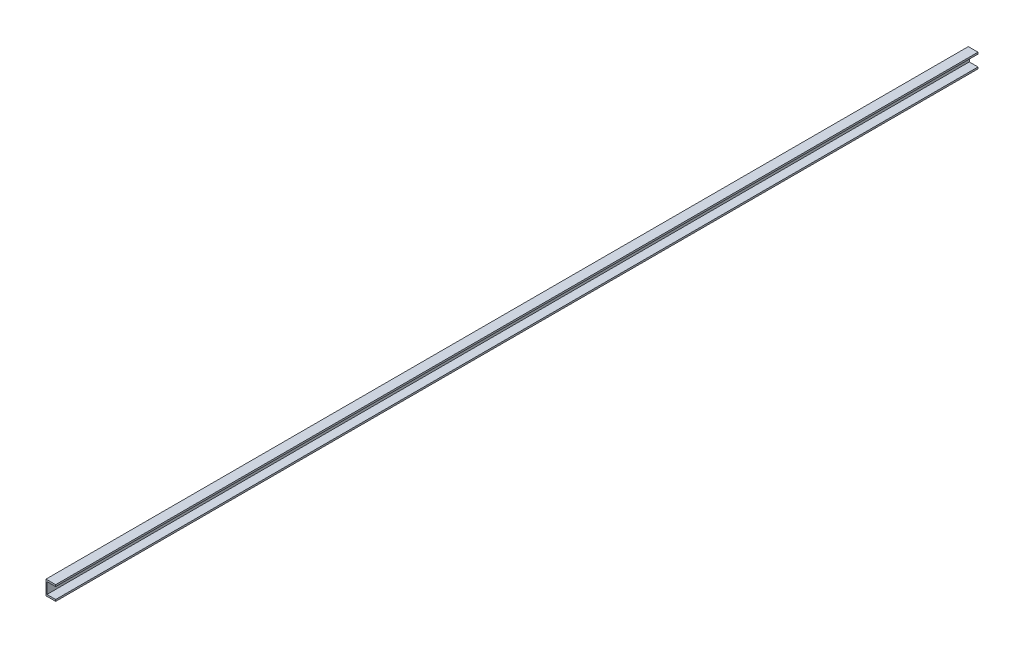
ISO-10303-21;
HEADER;
FILE_DESCRIPTION(('STEP AP214'),'2;1');
FILE_NAME('part.step','',(''),(''),'','','');
FILE_SCHEMA(('AUTOMOTIVE_DESIGN { 1 0 10303 214 1 1 1 1 }'));
ENDSEC;
DATA;
#1=APPLICATION_CONTEXT('core data for automotive mechanical design processes');
#2=APPLICATION_PROTOCOL_DEFINITION('international standard','automotive_design',2000,#1);
#3=PRODUCT_CONTEXT('',#1,'mechanical');
#4=PRODUCT('Part','Part','',(#3));
#5=PRODUCT_RELATED_PRODUCT_CATEGORY('part','',(#4));
#6=PRODUCT_DEFINITION_FORMATION('','',#4);
#7=PRODUCT_DEFINITION_CONTEXT('part definition',#1,'design');
#8=PRODUCT_DEFINITION('design','',#6,#7);
#9=PRODUCT_DEFINITION_SHAPE('','',#8);
#10=(LENGTH_UNIT() NAMED_UNIT(*) SI_UNIT(.MILLI.,.METRE.));
#11=(NAMED_UNIT(*) PLANE_ANGLE_UNIT() SI_UNIT($,.RADIAN.));
#12=(NAMED_UNIT(*) SI_UNIT($,.STERADIAN.) SOLID_ANGLE_UNIT());
#13=UNCERTAINTY_MEASURE_WITH_UNIT(LENGTH_MEASURE(1.E-05),#10,'distance_accuracy_value','');
#14=(GEOMETRIC_REPRESENTATION_CONTEXT(3) GLOBAL_UNCERTAINTY_ASSIGNED_CONTEXT((#13)) GLOBAL_UNIT_ASSIGNED_CONTEXT((#10,
#11,#12)) REPRESENTATION_CONTEXT('',''));
#15=CARTESIAN_POINT('',(0.,0.,0.));
#16=DIRECTION('',(0.,0.,1.));
#17=DIRECTION('',(1.,0.,0.));
#18=AXIS2_PLACEMENT_3D('',#15,#16,#17);
#19=CARTESIAN_POINT('',(53.086,-38.5786923076923,5062.));
#20=DIRECTION('',(0.,1.,0.));
#21=DIRECTION('',(0.,0.,1.));
#22=AXIS2_PLACEMENT_3D('',#19,#20,#21);
#23=PLANE('',#22);
#24=DIRECTION('',(1.,0.,0.));
#25=VECTOR('',#24,1.);
#26=CARTESIAN_POINT('',(53.086,-38.5786923076923,0.));
#27=LINE('',#26,#25);
#28=CARTESIAN_POINT('',(0.,-38.5786923076923,0.));
#29=VERTEX_POINT('',#28);
#30=CARTESIAN_POINT('',(53.086,-38.5786923076923,0.));
#31=VERTEX_POINT('',#30);
#32=EDGE_CURVE('E135',#29,#31,#27,.T.);
#33=ORIENTED_EDGE('',*,*,#32,.T.);
#34=DIRECTION('',(0.,0.,-1.));
#35=VECTOR('',#34,1.);
#36=CARTESIAN_POINT('',(53.086,-38.5786923076923,5062.));
#37=LINE('',#36,#35);
#38=CARTESIAN_POINT('',(53.086,-38.5786923076923,5062.));
#39=VERTEX_POINT('',#38);
#40=EDGE_CURVE('E43',#39,#31,#37,.T.);
#41=ORIENTED_EDGE('',*,*,#40,.F.);
#42=DIRECTION('',(1.,0.,0.));
#43=VECTOR('',#42,1.);
#44=CARTESIAN_POINT('',(53.086,-38.5786923076923,5062.));
#45=LINE('',#44,#43);
#46=CARTESIAN_POINT('',(0.,-38.5786923076923,5062.));
#47=VERTEX_POINT('',#46);
#48=EDGE_CURVE('E95',#47,#39,#45,.T.);
#49=ORIENTED_EDGE('',*,*,#48,.F.);
#50=DIRECTION('',(0.,0.,-1.));
#51=VECTOR('',#50,1.);
#52=CARTESIAN_POINT('',(0.,-38.5786923076923,5062.));
#53=LINE('',#52,#51);
#54=EDGE_CURVE('E11',#47,#29,#53,.T.);
#55=ORIENTED_EDGE('',*,*,#54,.T.);
#56=EDGE_LOOP('',(#33,#41,#49,#55));
#57=FACE_BOUND('',#56,.T.);
#58=ADVANCED_FACE('F35',(#57),#23,.F.);
#59=CARTESIAN_POINT('',(53.086,-29.2822923076923,5062.));
#60=DIRECTION('',(-1.,0.,0.));
#61=DIRECTION('',(0.,0.,1.));
#62=AXIS2_PLACEMENT_3D('',#59,#60,#61);
#63=PLANE('',#62);
#64=DIRECTION('',(0.,1.,0.));
#65=VECTOR('',#64,1.);
#66=CARTESIAN_POINT('',(53.086,-29.2822923076923,0.));
#67=LINE('',#66,#65);
#68=CARTESIAN_POINT('',(53.086,-29.2822923076923,0.));
#69=VERTEX_POINT('',#68);
#70=EDGE_CURVE('E137',#31,#69,#67,.T.);
#71=ORIENTED_EDGE('',*,*,#70,.T.);
#72=DIRECTION('',(0.,0.,-1.));
#73=VECTOR('',#72,1.);
#74=CARTESIAN_POINT('',(53.086,-29.2822923076923,5062.));
#75=LINE('',#74,#73);
#76=CARTESIAN_POINT('',(53.086,-29.2822923076923,5062.));
#77=VERTEX_POINT('',#76);
#78=EDGE_CURVE('E154',#77,#69,#75,.T.);
#79=ORIENTED_EDGE('',*,*,#78,.F.);
#80=DIRECTION('',(0.,1.,0.));
#81=VECTOR('',#80,1.);
#82=CARTESIAN_POINT('',(53.086,-29.2822923076923,5062.));
#83=LINE('',#82,#81);
#84=EDGE_CURVE('E162',#39,#77,#83,.T.);
#85=ORIENTED_EDGE('',*,*,#84,.F.);
#86=ORIENTED_EDGE('',*,*,#40,.T.);
#87=EDGE_LOOP('',(#71,#79,#85,#86));
#88=FACE_BOUND('',#87,.T.);
#89=ADVANCED_FACE('F160',(#88),#63,.F.);
#90=CARTESIAN_POINT('',(5.33400000000001,-29.2822923076923,5062.));
#91=DIRECTION('',(0.,-1.,0.));
#92=DIRECTION('',(0.,0.,-1.));
#93=AXIS2_PLACEMENT_3D('',#90,#91,#92);
#94=PLANE('',#93);
#95=DIRECTION('',(-1.,0.,0.));
#96=VECTOR('',#95,1.);
#97=CARTESIAN_POINT('',(5.33400000000001,-29.2822923076923,0.));
#98=LINE('',#97,#96);
#99=CARTESIAN_POINT('',(5.33400000000001,-29.2822923076923,0.));
#100=VERTEX_POINT('',#99);
#101=EDGE_CURVE('E139',#69,#100,#98,.T.);
#102=ORIENTED_EDGE('',*,*,#101,.T.);
#103=DIRECTION('',(0.,0.,-1.));
#104=VECTOR('',#103,1.);
#105=CARTESIAN_POINT('',(5.33400000000001,-29.2822923076923,5062.));
#106=LINE('',#105,#104);
#107=CARTESIAN_POINT('',(5.33400000000001,-29.2822923076923,5062.));
#108=VERTEX_POINT('',#107);
#109=EDGE_CURVE('E151',#108,#100,#106,.T.);
#110=ORIENTED_EDGE('',*,*,#109,.F.);
#111=DIRECTION('',(-1.,0.,0.));
#112=VECTOR('',#111,1.);
#113=CARTESIAN_POINT('',(5.33400000000001,-29.2822923076923,5062.));
#114=LINE('',#113,#112);
#115=EDGE_CURVE('E175',#77,#108,#114,.T.);
#116=ORIENTED_EDGE('',*,*,#115,.F.);
#117=ORIENTED_EDGE('',*,*,#78,.T.);
#118=EDGE_LOOP('',(#102,#110,#116,#117));
#119=FACE_BOUND('',#118,.T.);
#120=ADVANCED_FACE('F171',(#119),#94,.F.);
#121=CARTESIAN_POINT('',(5.334,31.8613692307692,5062.));
#122=DIRECTION('',(-1.,0.,0.));
#123=DIRECTION('',(0.,-1.,0.));
#124=AXIS2_PLACEMENT_3D('',#121,#122,#123);
#125=PLANE('',#124);
#126=DIRECTION('',(0.,1.,0.));
#127=VECTOR('',#126,1.);
#128=CARTESIAN_POINT('',(5.334,31.8613692307692,0.));
#129=LINE('',#128,#127);
#130=CARTESIAN_POINT('',(5.334,31.8613692307692,0.));
#131=VERTEX_POINT('',#130);
#132=EDGE_CURVE('E141',#100,#131,#129,.T.);
#133=ORIENTED_EDGE('',*,*,#132,.T.);
#134=DIRECTION('',(0.,0.,-1.));
#135=VECTOR('',#134,1.);
#136=CARTESIAN_POINT('',(5.334,31.8613692307692,5062.));
#137=LINE('',#136,#135);
#138=CARTESIAN_POINT('',(5.334,31.8613692307692,5062.));
#139=VERTEX_POINT('',#138);
#140=EDGE_CURVE('E124',#139,#131,#137,.T.);
#141=ORIENTED_EDGE('',*,*,#140,.F.);
#142=DIRECTION('',(0.,1.,0.));
#143=VECTOR('',#142,1.);
#144=CARTESIAN_POINT('',(5.334,31.8613692307692,5062.));
#145=LINE('',#144,#143);
#146=EDGE_CURVE('E115',#108,#139,#145,.T.);
#147=ORIENTED_EDGE('',*,*,#146,.F.);
#148=ORIENTED_EDGE('',*,*,#109,.T.);
#149=EDGE_LOOP('',(#133,#141,#147,#148));
#150=FACE_BOUND('',#149,.T.);
#151=ADVANCED_FACE('F174',(#150),#125,.F.);
#152=CARTESIAN_POINT('',(53.086,31.8613692307692,5062.));
#153=DIRECTION('',(0.,1.,0.));
#154=DIRECTION('',(-1.,0.,0.));
#155=AXIS2_PLACEMENT_3D('',#152,#153,#154);
#156=PLANE('',#155);
#157=DIRECTION('',(1.,0.,0.));
#158=VECTOR('',#157,1.);
#159=CARTESIAN_POINT('',(53.086,31.8613692307692,0.));
#160=LINE('',#159,#158);
#161=CARTESIAN_POINT('',(53.086,31.8613692307692,0.));
#162=VERTEX_POINT('',#161);
#163=EDGE_CURVE('E123',#131,#162,#160,.T.);
#164=ORIENTED_EDGE('',*,*,#163,.T.);
#165=DIRECTION('',(0.,0.,-1.));
#166=VECTOR('',#165,1.);
#167=CARTESIAN_POINT('',(53.086,31.8613692307692,5062.));
#168=LINE('',#167,#166);
#169=CARTESIAN_POINT('',(53.086,31.8613692307692,5062.));
#170=VERTEX_POINT('',#169);
#171=EDGE_CURVE('E120',#170,#162,#168,.T.);
#172=ORIENTED_EDGE('',*,*,#171,.F.);
#173=DIRECTION('',(1.,0.,0.));
#174=VECTOR('',#173,1.);
#175=CARTESIAN_POINT('',(53.086,31.8613692307692,5062.));
#176=LINE('',#175,#174);
#177=EDGE_CURVE('E109',#139,#170,#176,.T.);
#178=ORIENTED_EDGE('',*,*,#177,.F.);
#179=ORIENTED_EDGE('',*,*,#140,.T.);
#180=EDGE_LOOP('',(#164,#172,#178,#179));
#181=FACE_BOUND('',#180,.T.);
#182=ADVANCED_FACE('F121',(#181),#156,.F.);
#183=CARTESIAN_POINT('',(53.086,41.1577692307692,5062.));
#184=DIRECTION('',(-1.,0.,0.));
#185=DIRECTION('',(0.,0.,1.));
#186=AXIS2_PLACEMENT_3D('',#183,#184,#185);
#187=PLANE('',#186);
#188=DIRECTION('',(0.,1.,0.));
#189=VECTOR('',#188,1.);
#190=CARTESIAN_POINT('',(53.086,41.1577692307692,0.));
#191=LINE('',#190,#189);
#192=CARTESIAN_POINT('',(53.086,41.1577692307692,0.));
#193=VERTEX_POINT('',#192);
#194=EDGE_CURVE('E81',#162,#193,#191,.T.);
#195=ORIENTED_EDGE('',*,*,#194,.T.);
#196=DIRECTION('',(0.,0.,-1.));
#197=VECTOR('',#196,1.);
#198=CARTESIAN_POINT('',(53.086,41.1577692307692,5062.));
#199=LINE('',#198,#197);
#200=CARTESIAN_POINT('',(53.086,41.1577692307692,5062.));
#201=VERTEX_POINT('',#200);
#202=EDGE_CURVE('E125',#201,#193,#199,.T.);
#203=ORIENTED_EDGE('',*,*,#202,.F.);
#204=DIRECTION('',(0.,1.,0.));
#205=VECTOR('',#204,1.);
#206=CARTESIAN_POINT('',(53.086,41.1577692307692,5062.));
#207=LINE('',#206,#205);
#208=EDGE_CURVE('E113',#170,#201,#207,.T.);
#209=ORIENTED_EDGE('',*,*,#208,.F.);
#210=ORIENTED_EDGE('',*,*,#171,.T.);
#211=EDGE_LOOP('',(#195,#203,#209,#210));
#212=FACE_BOUND('',#211,.T.);
#213=ADVANCED_FACE('F127',(#212),#187,.F.);
#214=CARTESIAN_POINT('',(0.,41.1577692307692,5062.));
#215=DIRECTION('',(0.,-1.,0.));
#216=DIRECTION('',(0.,0.,-1.));
#217=AXIS2_PLACEMENT_3D('',#214,#215,#216);
#218=PLANE('',#217);
#219=DIRECTION('',(-1.,0.,0.));
#220=VECTOR('',#219,1.);
#221=CARTESIAN_POINT('',(0.,41.1577692307692,0.));
#222=LINE('',#221,#220);
#223=CARTESIAN_POINT('',(0.,41.1577692307692,0.));
#224=VERTEX_POINT('',#223);
#225=EDGE_CURVE('E88',#193,#224,#222,.T.);
#226=ORIENTED_EDGE('',*,*,#225,.T.);
#227=DIRECTION('',(0.,0.,-1.));
#228=VECTOR('',#227,1.);
#229=CARTESIAN_POINT('',(0.,41.1577692307692,5062.));
#230=LINE('',#229,#228);
#231=CARTESIAN_POINT('',(0.,41.1577692307692,5062.));
#232=VERTEX_POINT('',#231);
#233=EDGE_CURVE('E131',#232,#224,#230,.T.);
#234=ORIENTED_EDGE('',*,*,#233,.F.);
#235=DIRECTION('',(-1.,0.,0.));
#236=VECTOR('',#235,1.);
#237=CARTESIAN_POINT('',(0.,41.1577692307692,5062.));
#238=LINE('',#237,#236);
#239=EDGE_CURVE('E129',#201,#232,#238,.T.);
#240=ORIENTED_EDGE('',*,*,#239,.F.);
#241=ORIENTED_EDGE('',*,*,#202,.T.);
#242=EDGE_LOOP('',(#226,#234,#240,#241));
#243=FACE_BOUND('',#242,.T.);
#244=ADVANCED_FACE('F196',(#243),#218,.F.);
#245=CARTESIAN_POINT('',(0.,0.,5062.));
#246=DIRECTION('',(1.,0.,0.));
#247=DIRECTION('',(0.,0.,-1.));
#248=AXIS2_PLACEMENT_3D('',#245,#246,#247);
#249=PLANE('',#248);
#250=DIRECTION('',(0.,-1.,0.));
#251=VECTOR('',#250,1.);
#252=CARTESIAN_POINT('',(0.,0.,0.));
#253=LINE('',#252,#251);
#254=EDGE_CURVE('E146',#224,#29,#253,.T.);
#255=ORIENTED_EDGE('',*,*,#254,.T.);
#256=ORIENTED_EDGE('',*,*,#54,.F.);
#257=DIRECTION('',(0.,-1.,0.));
#258=VECTOR('',#257,1.);
#259=CARTESIAN_POINT('',(0.,-38.5786923076923,5062.));
#260=LINE('',#259,#258);
#261=EDGE_CURVE('E51',#232,#47,#260,.T.);
#262=ORIENTED_EDGE('',*,*,#261,.F.);
#263=ORIENTED_EDGE('',*,*,#233,.T.);
#264=EDGE_LOOP('',(#255,#256,#262,#263));
#265=FACE_BOUND('',#264,.T.);
#266=ADVANCED_FACE('F180',(#265),#249,.F.);
#267=CARTESIAN_POINT('',(0.,0.,5062.));
#268=DIRECTION('',(0.,0.,-1.));
#269=DIRECTION('',(-1.,0.,0.));
#270=AXIS2_PLACEMENT_3D('',#267,#268,#269);
#271=PLANE('',#270);
#272=ORIENTED_EDGE('',*,*,#261,.T.);
#273=ORIENTED_EDGE('',*,*,#48,.T.);
#274=ORIENTED_EDGE('',*,*,#84,.T.);
#275=ORIENTED_EDGE('',*,*,#115,.T.);
#276=ORIENTED_EDGE('',*,*,#146,.T.);
#277=ORIENTED_EDGE('',*,*,#177,.T.);
#278=ORIENTED_EDGE('',*,*,#208,.T.);
#279=ORIENTED_EDGE('',*,*,#239,.T.);
#280=EDGE_LOOP('',(#272,#273,#274,#275,#276,#277,#278,#279));
#281=FACE_BOUND('',#280,.T.);
#282=ADVANCED_FACE('F111',(#281),#271,.F.);
#283=CARTESIAN_POINT('',(0.,0.,0.));
#284=DIRECTION('',(0.,0.,-1.));
#285=DIRECTION('',(-1.,0.,0.));
#286=AXIS2_PLACEMENT_3D('',#283,#284,#285);
#287=PLANE('',#286);
#288=ORIENTED_EDGE('',*,*,#32,.F.);
#289=ORIENTED_EDGE('',*,*,#254,.F.);
#290=ORIENTED_EDGE('',*,*,#225,.F.);
#291=ORIENTED_EDGE('',*,*,#194,.F.);
#292=ORIENTED_EDGE('',*,*,#163,.F.);
#293=ORIENTED_EDGE('',*,*,#132,.F.);
#294=ORIENTED_EDGE('',*,*,#101,.F.);
#295=ORIENTED_EDGE('',*,*,#70,.F.);
#296=EDGE_LOOP('',(#288,#289,#290,#291,#292,#293,#294,#295));
#297=FACE_BOUND('',#296,.T.);
#298=ADVANCED_FACE('F166',(#297),#287,.T.);
#299=CLOSED_SHELL('',(#58,#89,#120,#151,#182,#213,#244,#266,#282,#298));
#300=MANIFOLD_SOLID_BREP('B2',#299);
#301=ADVANCED_BREP_SHAPE_REPRESENTATION('',(#18,#300),#14);
#302=SHAPE_DEFINITION_REPRESENTATION(#9,#301);
ENDSEC;
END-ISO-10303-21;
